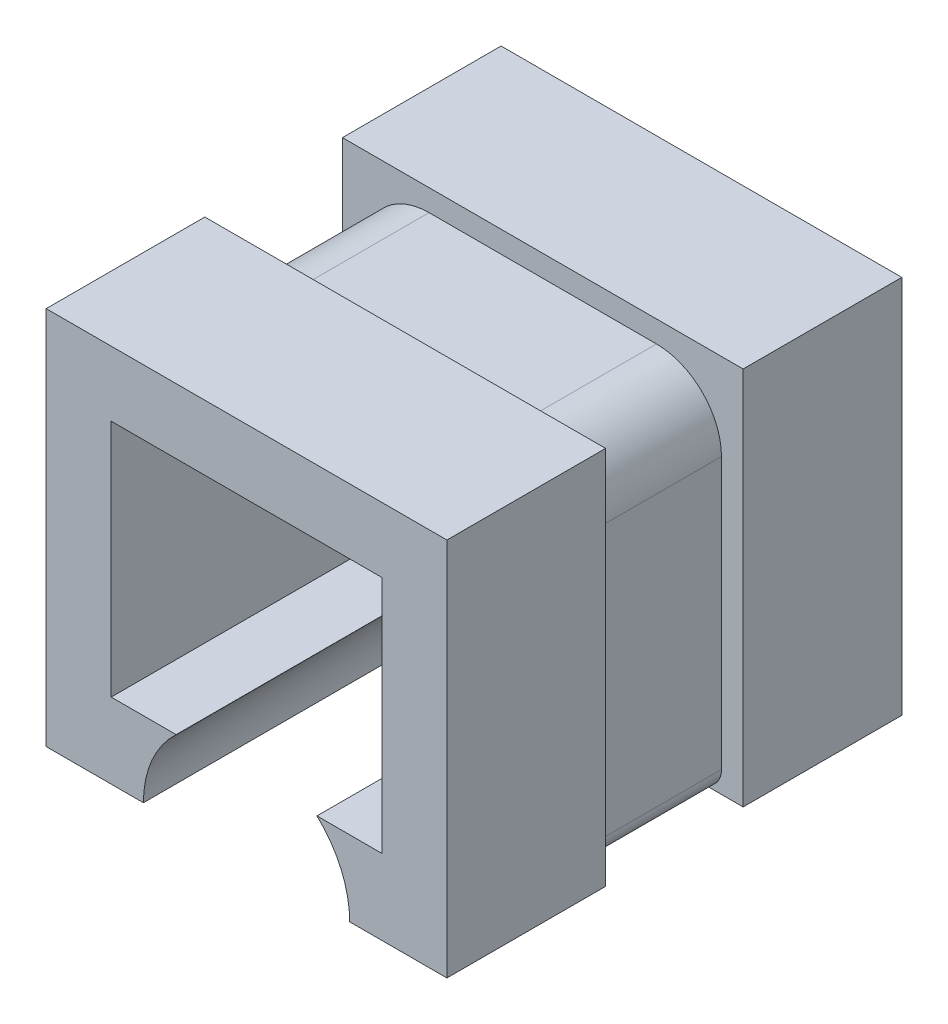
ISO-10303-21;
HEADER;
FILE_DESCRIPTION(('STEP AP214'),'2;1');
FILE_NAME('part.step','',(''),(''),'','','');
FILE_SCHEMA(('AUTOMOTIVE_DESIGN { 1 0 10303 214 1 1 1 1 }'));
ENDSEC;
DATA;
#1=APPLICATION_CONTEXT('core data for automotive mechanical design processes');
#2=APPLICATION_PROTOCOL_DEFINITION('international standard','automotive_design',2000,#1);
#3=PRODUCT_CONTEXT('',#1,'mechanical');
#4=PRODUCT('Part','Part','',(#3));
#5=PRODUCT_RELATED_PRODUCT_CATEGORY('part','',(#4));
#6=PRODUCT_DEFINITION_FORMATION('','',#4);
#7=PRODUCT_DEFINITION_CONTEXT('part definition',#1,'design');
#8=PRODUCT_DEFINITION('design','',#6,#7);
#9=PRODUCT_DEFINITION_SHAPE('','',#8);
#10=(LENGTH_UNIT() NAMED_UNIT(*) SI_UNIT(.MILLI.,.METRE.));
#11=(NAMED_UNIT(*) PLANE_ANGLE_UNIT() SI_UNIT($,.RADIAN.));
#12=(NAMED_UNIT(*) SI_UNIT($,.STERADIAN.) SOLID_ANGLE_UNIT());
#13=UNCERTAINTY_MEASURE_WITH_UNIT(LENGTH_MEASURE(1.E-05),#10,'distance_accuracy_value','');
#14=(GEOMETRIC_REPRESENTATION_CONTEXT(3) GLOBAL_UNCERTAINTY_ASSIGNED_CONTEXT((#13)) GLOBAL_UNIT_ASSIGNED_CONTEXT((#10,
#11,#12)) REPRESENTATION_CONTEXT('',''));
#15=CARTESIAN_POINT('',(0.,0.,0.));
#16=DIRECTION('',(0.,0.,1.));
#17=DIRECTION('',(1.,0.,0.));
#18=AXIS2_PLACEMENT_3D('',#15,#16,#17);
#19=CARTESIAN_POINT('',(-9.25000000000001,17.5125,10.5));
#20=DIRECTION('',(0.,-1.,0.));
#21=DIRECTION('',(1.,0.,0.));
#22=AXIS2_PLACEMENT_3D('',#19,#20,#21);
#23=PLANE('',#22);
#24=DIRECTION('',(-1.,0.,0.));
#25=VECTOR('',#24,1.);
#26=CARTESIAN_POINT('',(0.,17.5125,-3.175));
#27=LINE('',#26,#25);
#28=CARTESIAN_POINT('',(9.25000000000001,17.5125,-3.175));
#29=VERTEX_POINT('',#28);
#30=CARTESIAN_POINT('',(-9.25000000000001,17.5125,-3.175));
#31=VERTEX_POINT('',#30);
#32=EDGE_CURVE('E192',#29,#31,#27,.T.);
#33=ORIENTED_EDGE('',*,*,#32,.F.);
#34=DIRECTION('',(0.,0.,-1.));
#35=VECTOR('',#34,1.);
#36=CARTESIAN_POINT('',(9.24999999999999,17.5125,10.5));
#37=LINE('',#36,#35);
#38=CARTESIAN_POINT('',(9.24999999999999,17.5125,-10.5));
#39=VERTEX_POINT('',#38);
#40=EDGE_CURVE('E196',#29,#39,#37,.T.);
#41=ORIENTED_EDGE('',*,*,#40,.T.);
#42=DIRECTION('',(-1.,0.,0.));
#43=VECTOR('',#42,1.);
#44=CARTESIAN_POINT('',(-9.25000000000001,17.5125,-10.5));
#45=LINE('',#44,#43);
#46=CARTESIAN_POINT('',(-9.25000000000001,17.5125,-10.5));
#47=VERTEX_POINT('',#46);
#48=EDGE_CURVE('E315',#39,#47,#45,.T.);
#49=ORIENTED_EDGE('',*,*,#48,.T.);
#50=DIRECTION('',(0.,0.,-1.));
#51=VECTOR('',#50,1.);
#52=CARTESIAN_POINT('',(-9.25000000000001,17.5125,10.5));
#53=LINE('',#52,#51);
#54=EDGE_CURVE('E198',#31,#47,#53,.T.);
#55=ORIENTED_EDGE('',*,*,#54,.F.);
#56=EDGE_LOOP('',(#33,#41,#49,#55));
#57=FACE_BOUND('',#56,.T.);
#58=ADVANCED_FACE('F33',(#57),#23,.F.);
#59=CARTESIAN_POINT('',(9.25,0.,10.5));
#60=DIRECTION('',(0.,1.,0.));
#61=DIRECTION('',(-1.,0.,0.));
#62=AXIS2_PLACEMENT_3D('',#59,#60,#61);
#63=PLANE('',#62);
#64=DIRECTION('',(0.,0.,1.));
#65=VECTOR('',#64,1.);
#66=CARTESIAN_POINT('',(7.25,0.,3.175));
#67=LINE('',#66,#65);
#68=CARTESIAN_POINT('',(7.25,0.,-3.175));
#69=VERTEX_POINT('',#68);
#70=CARTESIAN_POINT('',(7.25,0.,3.175));
#71=VERTEX_POINT('',#70);
#72=EDGE_CURVE('E271',#69,#71,#67,.T.);
#73=ORIENTED_EDGE('',*,*,#72,.T.);
#74=DIRECTION('',(-1.,0.,0.));
#75=VECTOR('',#74,1.);
#76=CARTESIAN_POINT('',(9.25,0.,3.175));
#77=LINE('',#76,#75);
#78=CARTESIAN_POINT('',(9.25,0.,3.175));
#79=VERTEX_POINT('',#78);
#80=EDGE_CURVE('E211',#79,#71,#77,.T.);
#81=ORIENTED_EDGE('',*,*,#80,.F.);
#82=DIRECTION('',(0.,0.,-1.));
#83=VECTOR('',#82,1.);
#84=CARTESIAN_POINT('',(9.25,0.,10.5));
#85=LINE('',#84,#83);
#86=CARTESIAN_POINT('',(9.25,0.,10.5));
#87=VERTEX_POINT('',#86);
#88=EDGE_CURVE('E226',#87,#79,#85,.T.);
#89=ORIENTED_EDGE('',*,*,#88,.F.);
#90=DIRECTION('',(1.,0.,0.));
#91=VECTOR('',#90,1.);
#92=CARTESIAN_POINT('',(9.25,0.,10.5));
#93=LINE('',#92,#91);
#94=CARTESIAN_POINT('',(4.7625,0.,10.5));
#95=VERTEX_POINT('',#94);
#96=EDGE_CURVE('E342',#95,#87,#93,.T.);
#97=ORIENTED_EDGE('',*,*,#96,.F.);
#98=DIRECTION('',(0.,0.,-1.));
#99=VECTOR('',#98,1.);
#100=CARTESIAN_POINT('',(4.7625,0.,10.5));
#101=LINE('',#100,#99);
#102=CARTESIAN_POINT('',(4.7625,0.,-10.5));
#103=VERTEX_POINT('',#102);
#104=EDGE_CURVE('E229',#95,#103,#101,.T.);
#105=ORIENTED_EDGE('',*,*,#104,.T.);
#106=DIRECTION('',(1.,0.,0.));
#107=VECTOR('',#106,1.);
#108=CARTESIAN_POINT('',(9.25,0.,-10.5));
#109=LINE('',#108,#107);
#110=CARTESIAN_POINT('',(9.25,0.,-10.5));
#111=VERTEX_POINT('',#110);
#112=EDGE_CURVE('E318',#103,#111,#109,.T.);
#113=ORIENTED_EDGE('',*,*,#112,.T.);
#114=CARTESIAN_POINT('',(9.25,0.,-3.175));
#115=VERTEX_POINT('',#114);
#116=EDGE_CURVE('E221',#115,#111,#85,.T.);
#117=ORIENTED_EDGE('',*,*,#116,.F.);
#118=DIRECTION('',(-1.,0.,0.));
#119=VECTOR('',#118,1.);
#120=CARTESIAN_POINT('',(9.25,0.,-3.175));
#121=LINE('',#120,#119);
#122=EDGE_CURVE('E207',#115,#69,#121,.T.);
#123=ORIENTED_EDGE('',*,*,#122,.T.);
#124=EDGE_LOOP('',(#73,#81,#89,#97,#105,#113,#117,#123));
#125=FACE_BOUND('',#124,.T.);
#126=ADVANCED_FACE('F413',(#125),#63,.F.);
#127=CARTESIAN_POINT('',(9.24999999999999,17.5125,10.5));
#128=DIRECTION('',(-1.,0.,0.));
#129=DIRECTION('',(0.,-1.,0.));
#130=AXIS2_PLACEMENT_3D('',#127,#128,#129);
#131=PLANE('',#130);
#132=DIRECTION('',(0.,-1.,0.));
#133=VECTOR('',#132,1.);
#134=CARTESIAN_POINT('',(9.25000000000001,17.5125,-3.175));
#135=LINE('',#134,#133);
#136=EDGE_CURVE('E204',#29,#115,#135,.T.);
#137=ORIENTED_EDGE('',*,*,#136,.T.);
#138=ORIENTED_EDGE('',*,*,#116,.T.);
#139=DIRECTION('',(0.,1.,0.));
#140=VECTOR('',#139,1.);
#141=CARTESIAN_POINT('',(9.24999999999999,17.5125,-10.5));
#142=LINE('',#141,#140);
#143=EDGE_CURVE('E215',#111,#39,#142,.T.);
#144=ORIENTED_EDGE('',*,*,#143,.T.);
#145=ORIENTED_EDGE('',*,*,#40,.F.);
#146=EDGE_LOOP('',(#137,#138,#144,#145));
#147=FACE_BOUND('',#146,.T.);
#148=ADVANCED_FACE('F213',(#147),#131,.F.);
#149=CARTESIAN_POINT('',(9.24999999999999,17.5125,10.5));
#150=VERTEX_POINT('',#149);
#151=CARTESIAN_POINT('',(9.25000000000001,17.5125,3.175));
#152=VERTEX_POINT('',#151);
#153=EDGE_CURVE('E217',#150,#152,#37,.T.);
#154=ORIENTED_EDGE('',*,*,#153,.T.);
#155=DIRECTION('',(-1.,0.,0.));
#156=VECTOR('',#155,1.);
#157=CARTESIAN_POINT('',(0.,17.5125,3.175));
#158=LINE('',#157,#156);
#159=CARTESIAN_POINT('',(-9.25000000000001,17.5125,3.175));
#160=VERTEX_POINT('',#159);
#161=EDGE_CURVE('E358',#152,#160,#158,.T.);
#162=ORIENTED_EDGE('',*,*,#161,.T.);
#163=CARTESIAN_POINT('',(-9.25000000000001,17.5125,10.5));
#164=VERTEX_POINT('',#163);
#165=EDGE_CURVE('E218',#164,#160,#53,.T.);
#166=ORIENTED_EDGE('',*,*,#165,.F.);
#167=DIRECTION('',(-1.,0.,0.));
#168=VECTOR('',#167,1.);
#169=CARTESIAN_POINT('',(-9.25000000000001,17.5125,10.5));
#170=LINE('',#169,#168);
#171=EDGE_CURVE('E338',#150,#164,#170,.T.);
#172=ORIENTED_EDGE('',*,*,#171,.F.);
#173=EDGE_LOOP('',(#154,#162,#166,#172));
#174=FACE_BOUND('',#173,.T.);
#175=ADVANCED_FACE('F415',(#174),#23,.F.);
#176=CARTESIAN_POINT('',(-9.25,0.,10.5));
#177=DIRECTION('',(1.,0.,0.));
#178=DIRECTION('',(0.,1.,0.));
#179=AXIS2_PLACEMENT_3D('',#176,#177,#178);
#180=PLANE('',#179);
#181=DIRECTION('',(0.,-1.,0.));
#182=VECTOR('',#181,1.);
#183=CARTESIAN_POINT('',(-9.25000000000001,17.5125,-3.175));
#184=LINE('',#183,#182);
#185=CARTESIAN_POINT('',(-9.25,0.,-3.175));
#186=VERTEX_POINT('',#185);
#187=EDGE_CURVE('E298',#31,#186,#184,.T.);
#188=ORIENTED_EDGE('',*,*,#187,.F.);
#189=ORIENTED_EDGE('',*,*,#54,.T.);
#190=DIRECTION('',(0.,-1.,0.));
#191=VECTOR('',#190,1.);
#192=CARTESIAN_POINT('',(-9.25,0.,-10.5));
#193=LINE('',#192,#191);
#194=CARTESIAN_POINT('',(-9.25,0.,-10.5));
#195=VERTEX_POINT('',#194);
#196=EDGE_CURVE('E303',#47,#195,#193,.T.);
#197=ORIENTED_EDGE('',*,*,#196,.T.);
#198=DIRECTION('',(0.,0.,-1.));
#199=VECTOR('',#198,1.);
#200=CARTESIAN_POINT('',(-9.25,0.,10.5));
#201=LINE('',#200,#199);
#202=EDGE_CURVE('E295',#186,#195,#201,.T.);
#203=ORIENTED_EDGE('',*,*,#202,.F.);
#204=EDGE_LOOP('',(#188,#189,#197,#203));
#205=FACE_BOUND('',#204,.T.);
#206=ADVANCED_FACE('F301',(#205),#180,.F.);
#207=CARTESIAN_POINT('',(-4.7625,0.,10.5));
#208=DIRECTION('',(0.,1.,0.));
#209=DIRECTION('',(-1.,0.,0.));
#210=AXIS2_PLACEMENT_3D('',#207,#208,#209);
#211=PLANE('',#210);
#212=DIRECTION('',(1.,0.,0.));
#213=VECTOR('',#212,1.);
#214=CARTESIAN_POINT('',(-9.25,0.,3.175));
#215=LINE('',#214,#213);
#216=CARTESIAN_POINT('',(-9.25,0.,3.175));
#217=VERTEX_POINT('',#216);
#218=CARTESIAN_POINT('',(-7.25,0.,3.175));
#219=VERTEX_POINT('',#218);
#220=EDGE_CURVE('E48',#217,#219,#215,.T.);
#221=ORIENTED_EDGE('',*,*,#220,.T.);
#222=DIRECTION('',(0.,0.,1.));
#223=VECTOR('',#222,1.);
#224=CARTESIAN_POINT('',(-7.25,0.,10.5));
#225=LINE('',#224,#223);
#226=CARTESIAN_POINT('',(-7.25,0.,-3.175));
#227=VERTEX_POINT('',#226);
#228=EDGE_CURVE('E279',#219,#227,#225,.F.);
#229=ORIENTED_EDGE('',*,*,#228,.T.);
#230=DIRECTION('',(1.,0.,0.));
#231=VECTOR('',#230,1.);
#232=CARTESIAN_POINT('',(-9.25,0.,-3.175));
#233=LINE('',#232,#231);
#234=EDGE_CURVE('E55',#186,#227,#233,.T.);
#235=ORIENTED_EDGE('',*,*,#234,.F.);
#236=ORIENTED_EDGE('',*,*,#202,.T.);
#237=DIRECTION('',(1.,0.,0.));
#238=VECTOR('',#237,1.);
#239=CARTESIAN_POINT('',(-4.7625,0.,-10.5));
#240=LINE('',#239,#238);
#241=CARTESIAN_POINT('',(-4.7625,0.,-10.5));
#242=VERTEX_POINT('',#241);
#243=EDGE_CURVE('E311',#195,#242,#240,.T.);
#244=ORIENTED_EDGE('',*,*,#243,.T.);
#245=DIRECTION('',(0.,0.,-1.));
#246=VECTOR('',#245,1.);
#247=CARTESIAN_POINT('',(-4.7625,0.,10.5));
#248=LINE('',#247,#246);
#249=CARTESIAN_POINT('',(-4.7625,0.,10.5));
#250=VERTEX_POINT('',#249);
#251=EDGE_CURVE('E306',#250,#242,#248,.T.);
#252=ORIENTED_EDGE('',*,*,#251,.F.);
#253=DIRECTION('',(1.,0.,0.));
#254=VECTOR('',#253,1.);
#255=CARTESIAN_POINT('',(-4.7625,0.,10.5));
#256=LINE('',#255,#254);
#257=CARTESIAN_POINT('',(-9.25,0.,10.5));
#258=VERTEX_POINT('',#257);
#259=EDGE_CURVE('E308',#258,#250,#256,.T.);
#260=ORIENTED_EDGE('',*,*,#259,.F.);
#261=EDGE_CURVE('E305',#258,#217,#201,.T.);
#262=ORIENTED_EDGE('',*,*,#261,.T.);
#263=EDGE_LOOP('',(#221,#229,#235,#236,#244,#252,#260,#262));
#264=FACE_BOUND('',#263,.T.);
#265=ADVANCED_FACE('F293',(#264),#211,.F.);
#266=CARTESIAN_POINT('',(0.,0.,10.5));
#267=DIRECTION('',(0.,0.,-1.));
#268=DIRECTION('',(-1.,0.,0.));
#269=AXIS2_PLACEMENT_3D('',#266,#267,#268);
#270=CYLINDRICAL_SURFACE('',#269,4.7625);
#271=CARTESIAN_POINT('',(0.,0.,-10.5));
#272=DIRECTION('',(0.,0.,-1.));
#273=DIRECTION('',(1.,0.,0.));
#274=AXIS2_PLACEMENT_3D('',#271,#272,#273);
#275=CIRCLE('',#274,4.7625);
#276=CARTESIAN_POINT('',(-3.25,3.48122194782234,-10.5));
#277=VERTEX_POINT('',#276);
#278=EDGE_CURVE('E200',#242,#277,#275,.T.);
#279=ORIENTED_EDGE('',*,*,#278,.T.);
#280=DIRECTION('',(0.,0.,-1.));
#281=VECTOR('',#280,1.);
#282=CARTESIAN_POINT('',(-3.25,3.48122194782234,10.5));
#283=LINE('',#282,#281);
#284=CARTESIAN_POINT('',(-3.25,3.48122194782234,10.5));
#285=VERTEX_POINT('',#284);
#286=EDGE_CURVE('E247',#285,#277,#283,.T.);
#287=ORIENTED_EDGE('',*,*,#286,.F.);
#288=CARTESIAN_POINT('',(0.,0.,10.5));
#289=DIRECTION('',(0.,0.,-1.));
#290=DIRECTION('',(1.,0.,0.));
#291=AXIS2_PLACEMENT_3D('',#288,#289,#290);
#292=CIRCLE('',#291,4.7625);
#293=EDGE_CURVE('E313',#250,#285,#292,.T.);
#294=ORIENTED_EDGE('',*,*,#293,.F.);
#295=ORIENTED_EDGE('',*,*,#251,.T.);
#296=EDGE_LOOP('',(#279,#287,#294,#295));
#297=FACE_BOUND('',#296,.T.);
#298=ADVANCED_FACE('F453',(#297),#270,.F.);
#299=CARTESIAN_POINT('',(-6.25,3.48122194782234,10.5));
#300=DIRECTION('',(0.,-1.,0.));
#301=DIRECTION('',(0.,0.,-1.));
#302=AXIS2_PLACEMENT_3D('',#299,#300,#301);
#303=PLANE('',#302);
#304=DIRECTION('',(-1.,0.,0.));
#305=VECTOR('',#304,1.);
#306=CARTESIAN_POINT('',(-6.25,3.48122194782234,-10.5));
#307=LINE('',#306,#305);
#308=CARTESIAN_POINT('',(-6.25,3.48122194782234,-10.5));
#309=VERTEX_POINT('',#308);
#310=EDGE_CURVE('E331',#277,#309,#307,.T.);
#311=ORIENTED_EDGE('',*,*,#310,.T.);
#312=DIRECTION('',(0.,0.,-1.));
#313=VECTOR('',#312,1.);
#314=CARTESIAN_POINT('',(-6.25,3.48122194782234,10.5));
#315=LINE('',#314,#313);
#316=CARTESIAN_POINT('',(-6.25,3.48122194782234,10.5));
#317=VERTEX_POINT('',#316);
#318=EDGE_CURVE('E244',#317,#309,#315,.T.);
#319=ORIENTED_EDGE('',*,*,#318,.F.);
#320=DIRECTION('',(-1.,0.,0.));
#321=VECTOR('',#320,1.);
#322=CARTESIAN_POINT('',(-6.25,3.48122194782234,10.5));
#323=LINE('',#322,#321);
#324=EDGE_CURVE('E354',#285,#317,#323,.T.);
#325=ORIENTED_EDGE('',*,*,#324,.F.);
#326=ORIENTED_EDGE('',*,*,#286,.T.);
#327=EDGE_LOOP('',(#311,#319,#325,#326));
#328=FACE_BOUND('',#327,.T.);
#329=ADVANCED_FACE('F456',(#328),#303,.F.);
#330=CARTESIAN_POINT('',(-6.25,14.5125,10.5));
#331=DIRECTION('',(-1.,0.,0.));
#332=DIRECTION('',(0.,-1.,0.));
#333=AXIS2_PLACEMENT_3D('',#330,#331,#332);
#334=PLANE('',#333);
#335=DIRECTION('',(0.,1.,0.));
#336=VECTOR('',#335,1.);
#337=CARTESIAN_POINT('',(-6.25,14.5125,-10.5));
#338=LINE('',#337,#336);
#339=CARTESIAN_POINT('',(-6.25,14.5125,-10.5));
#340=VERTEX_POINT('',#339);
#341=EDGE_CURVE('E329',#309,#340,#338,.T.);
#342=ORIENTED_EDGE('',*,*,#341,.T.);
#343=DIRECTION('',(0.,0.,-1.));
#344=VECTOR('',#343,1.);
#345=CARTESIAN_POINT('',(-6.25,14.5125,10.5));
#346=LINE('',#345,#344);
#347=CARTESIAN_POINT('',(-6.25,14.5125,10.5));
#348=VERTEX_POINT('',#347);
#349=EDGE_CURVE('E241',#348,#340,#346,.T.);
#350=ORIENTED_EDGE('',*,*,#349,.F.);
#351=DIRECTION('',(0.,1.,0.));
#352=VECTOR('',#351,1.);
#353=CARTESIAN_POINT('',(-6.25,14.5125,10.5));
#354=LINE('',#353,#352);
#355=EDGE_CURVE('E352',#317,#348,#354,.T.);
#356=ORIENTED_EDGE('',*,*,#355,.F.);
#357=ORIENTED_EDGE('',*,*,#318,.T.);
#358=EDGE_LOOP('',(#342,#350,#356,#357));
#359=FACE_BOUND('',#358,.T.);
#360=ADVANCED_FACE('F460',(#359),#334,.F.);
#361=CARTESIAN_POINT('',(6.25,14.5125,10.5));
#362=DIRECTION('',(0.,1.,0.));
#363=DIRECTION('',(0.,0.,1.));
#364=AXIS2_PLACEMENT_3D('',#361,#362,#363);
#365=PLANE('',#364);
#366=DIRECTION('',(1.,0.,0.));
#367=VECTOR('',#366,1.);
#368=CARTESIAN_POINT('',(6.25,14.5125,-10.5));
#369=LINE('',#368,#367);
#370=CARTESIAN_POINT('',(6.25,14.5125,-10.5));
#371=VERTEX_POINT('',#370);
#372=EDGE_CURVE('E327',#340,#371,#369,.T.);
#373=ORIENTED_EDGE('',*,*,#372,.T.);
#374=DIRECTION('',(0.,0.,-1.));
#375=VECTOR('',#374,1.);
#376=CARTESIAN_POINT('',(6.25,14.5125,10.5));
#377=LINE('',#376,#375);
#378=CARTESIAN_POINT('',(6.25,14.5125,10.5));
#379=VERTEX_POINT('',#378);
#380=EDGE_CURVE('E238',#379,#371,#377,.T.);
#381=ORIENTED_EDGE('',*,*,#380,.F.);
#382=DIRECTION('',(1.,0.,0.));
#383=VECTOR('',#382,1.);
#384=CARTESIAN_POINT('',(6.25,14.5125,10.5));
#385=LINE('',#384,#383);
#386=EDGE_CURVE('E350',#348,#379,#385,.T.);
#387=ORIENTED_EDGE('',*,*,#386,.F.);
#388=ORIENTED_EDGE('',*,*,#349,.T.);
#389=EDGE_LOOP('',(#373,#381,#387,#388));
#390=FACE_BOUND('',#389,.T.);
#391=ADVANCED_FACE('F464',(#390),#365,.F.);
#392=CARTESIAN_POINT('',(6.25,3.48122194782234,10.5));
#393=DIRECTION('',(1.,0.,0.));
#394=DIRECTION('',(0.,1.,0.));
#395=AXIS2_PLACEMENT_3D('',#392,#393,#394);
#396=PLANE('',#395);
#397=DIRECTION('',(0.,-1.,0.));
#398=VECTOR('',#397,1.);
#399=CARTESIAN_POINT('',(6.25,3.48122194782234,-10.5));
#400=LINE('',#399,#398);
#401=CARTESIAN_POINT('',(6.25,3.48122194782234,-10.5));
#402=VERTEX_POINT('',#401);
#403=EDGE_CURVE('E325',#371,#402,#400,.T.);
#404=ORIENTED_EDGE('',*,*,#403,.T.);
#405=DIRECTION('',(0.,0.,-1.));
#406=VECTOR('',#405,1.);
#407=CARTESIAN_POINT('',(6.25,3.48122194782234,10.5));
#408=LINE('',#407,#406);
#409=CARTESIAN_POINT('',(6.25,3.48122194782234,10.5));
#410=VERTEX_POINT('',#409);
#411=EDGE_CURVE('E235',#410,#402,#408,.T.);
#412=ORIENTED_EDGE('',*,*,#411,.F.);
#413=DIRECTION('',(0.,-1.,0.));
#414=VECTOR('',#413,1.);
#415=CARTESIAN_POINT('',(6.25,3.48122194782234,10.5));
#416=LINE('',#415,#414);
#417=EDGE_CURVE('E348',#379,#410,#416,.T.);
#418=ORIENTED_EDGE('',*,*,#417,.F.);
#419=ORIENTED_EDGE('',*,*,#380,.T.);
#420=EDGE_LOOP('',(#404,#412,#418,#419));
#421=FACE_BOUND('',#420,.T.);
#422=ADVANCED_FACE('F468',(#421),#396,.F.);
#423=CARTESIAN_POINT('',(6.25,3.48122194782234,10.5));
#424=DIRECTION('',(0.,-1.,0.));
#425=DIRECTION('',(0.,0.,-1.));
#426=AXIS2_PLACEMENT_3D('',#423,#424,#425);
#427=PLANE('',#426);
#428=DIRECTION('',(-1.,0.,0.));
#429=VECTOR('',#428,1.);
#430=CARTESIAN_POINT('',(6.25,3.48122194782234,-10.5));
#431=LINE('',#430,#429);
#432=CARTESIAN_POINT('',(3.25,3.48122194782234,-10.5));
#433=VERTEX_POINT('',#432);
#434=EDGE_CURVE('E323',#402,#433,#431,.T.);
#435=ORIENTED_EDGE('',*,*,#434,.T.);
#436=DIRECTION('',(0.,0.,-1.));
#437=VECTOR('',#436,1.);
#438=CARTESIAN_POINT('',(3.25,3.48122194782234,10.5));
#439=LINE('',#438,#437);
#440=CARTESIAN_POINT('',(3.25,3.48122194782234,10.5));
#441=VERTEX_POINT('',#440);
#442=EDGE_CURVE('E232',#441,#433,#439,.T.);
#443=ORIENTED_EDGE('',*,*,#442,.F.);
#444=DIRECTION('',(-1.,0.,0.));
#445=VECTOR('',#444,1.);
#446=CARTESIAN_POINT('',(6.25,3.48122194782234,10.5));
#447=LINE('',#446,#445);
#448=EDGE_CURVE('E346',#410,#441,#447,.T.);
#449=ORIENTED_EDGE('',*,*,#448,.F.);
#450=ORIENTED_EDGE('',*,*,#411,.T.);
#451=EDGE_LOOP('',(#435,#443,#449,#450));
#452=FACE_BOUND('',#451,.T.);
#453=ADVANCED_FACE('F472',(#452),#427,.F.);
#454=CARTESIAN_POINT('',(0.,0.,10.5));
#455=DIRECTION('',(0.,0.,-1.));
#456=DIRECTION('',(-1.,0.,0.));
#457=AXIS2_PLACEMENT_3D('',#454,#455,#456);
#458=CYLINDRICAL_SURFACE('',#457,4.7625);
#459=CARTESIAN_POINT('',(0.,0.,-10.5));
#460=DIRECTION('',(0.,0.,-1.));
#461=DIRECTION('',(1.,0.,0.));
#462=AXIS2_PLACEMENT_3D('',#459,#460,#461);
#463=CIRCLE('',#462,4.7625);
#464=EDGE_CURVE('E321',#433,#103,#463,.T.);
#465=ORIENTED_EDGE('',*,*,#464,.T.);
#466=ORIENTED_EDGE('',*,*,#104,.F.);
#467=CARTESIAN_POINT('',(0.,0.,10.5));
#468=DIRECTION('',(0.,0.,-1.));
#469=DIRECTION('',(1.,0.,0.));
#470=AXIS2_PLACEMENT_3D('',#467,#468,#469);
#471=CIRCLE('',#470,4.7625);
#472=EDGE_CURVE('E344',#441,#95,#471,.T.);
#473=ORIENTED_EDGE('',*,*,#472,.F.);
#474=ORIENTED_EDGE('',*,*,#442,.T.);
#475=EDGE_LOOP('',(#465,#466,#473,#474));
#476=FACE_BOUND('',#475,.T.);
#477=ADVANCED_FACE('F476',(#476),#458,.F.);
#478=ORIENTED_EDGE('',*,*,#88,.T.);
#479=DIRECTION('',(0.,-1.,0.));
#480=VECTOR('',#479,1.);
#481=CARTESIAN_POINT('',(9.25000000000001,17.5125,3.175));
#482=LINE('',#481,#480);
#483=EDGE_CURVE('E375',#152,#79,#482,.T.);
#484=ORIENTED_EDGE('',*,*,#483,.F.);
#485=ORIENTED_EDGE('',*,*,#153,.F.);
#486=DIRECTION('',(0.,1.,0.));
#487=VECTOR('',#486,1.);
#488=CARTESIAN_POINT('',(9.24999999999999,17.5125,10.5));
#489=LINE('',#488,#487);
#490=EDGE_CURVE('E340',#87,#150,#489,.T.);
#491=ORIENTED_EDGE('',*,*,#490,.F.);
#492=EDGE_LOOP('',(#478,#484,#485,#491));
#493=FACE_BOUND('',#492,.T.);
#494=ADVANCED_FACE('F430',(#493),#131,.F.);
#495=ORIENTED_EDGE('',*,*,#165,.T.);
#496=DIRECTION('',(0.,-1.,0.));
#497=VECTOR('',#496,1.);
#498=CARTESIAN_POINT('',(-9.25000000000001,17.5125,3.175));
#499=LINE('',#498,#497);
#500=EDGE_CURVE('E366',#160,#217,#499,.T.);
#501=ORIENTED_EDGE('',*,*,#500,.T.);
#502=ORIENTED_EDGE('',*,*,#261,.F.);
#503=DIRECTION('',(0.,-1.,0.));
#504=VECTOR('',#503,1.);
#505=CARTESIAN_POINT('',(-9.25,0.,10.5));
#506=LINE('',#505,#504);
#507=EDGE_CURVE('E336',#164,#258,#506,.T.);
#508=ORIENTED_EDGE('',*,*,#507,.F.);
#509=EDGE_LOOP('',(#495,#501,#502,#508));
#510=FACE_BOUND('',#509,.T.);
#511=ADVANCED_FACE('F429',(#510),#180,.F.);
#512=CARTESIAN_POINT('',(0.,0.,10.5));
#513=DIRECTION('',(0.,0.,1.));
#514=DIRECTION('',(1.,0.,0.));
#515=AXIS2_PLACEMENT_3D('',#512,#513,#514);
#516=PLANE('',#515);
#517=ORIENTED_EDGE('',*,*,#293,.T.);
#518=ORIENTED_EDGE('',*,*,#324,.T.);
#519=ORIENTED_EDGE('',*,*,#355,.T.);
#520=ORIENTED_EDGE('',*,*,#386,.T.);
#521=ORIENTED_EDGE('',*,*,#417,.T.);
#522=ORIENTED_EDGE('',*,*,#448,.T.);
#523=ORIENTED_EDGE('',*,*,#472,.T.);
#524=ORIENTED_EDGE('',*,*,#96,.T.);
#525=ORIENTED_EDGE('',*,*,#490,.T.);
#526=ORIENTED_EDGE('',*,*,#171,.T.);
#527=ORIENTED_EDGE('',*,*,#507,.T.);
#528=ORIENTED_EDGE('',*,*,#259,.T.);
#529=EDGE_LOOP('',(#517,#518,#519,#520,#521,#522,#523,#524,#525,#526,#527,#528));
#530=FACE_BOUND('',#529,.T.);
#531=ADVANCED_FACE('F484',(#530),#516,.T.);
#532=CARTESIAN_POINT('',(0.,0.,-10.5));
#533=DIRECTION('',(0.,0.,1.));
#534=DIRECTION('',(1.,0.,0.));
#535=AXIS2_PLACEMENT_3D('',#532,#533,#534);
#536=PLANE('',#535);
#537=ORIENTED_EDGE('',*,*,#278,.F.);
#538=ORIENTED_EDGE('',*,*,#243,.F.);
#539=ORIENTED_EDGE('',*,*,#196,.F.);
#540=ORIENTED_EDGE('',*,*,#48,.F.);
#541=ORIENTED_EDGE('',*,*,#143,.F.);
#542=ORIENTED_EDGE('',*,*,#112,.F.);
#543=ORIENTED_EDGE('',*,*,#464,.F.);
#544=ORIENTED_EDGE('',*,*,#434,.F.);
#545=ORIENTED_EDGE('',*,*,#403,.F.);
#546=ORIENTED_EDGE('',*,*,#372,.F.);
#547=ORIENTED_EDGE('',*,*,#341,.F.);
#548=ORIENTED_EDGE('',*,*,#310,.F.);
#549=EDGE_LOOP('',(#537,#538,#539,#540,#541,#542,#543,#544,#545,#546,#547,#548));
#550=FACE_BOUND('',#549,.T.);
#551=ADVANCED_FACE('F409',(#550),#536,.F.);
#552=CARTESIAN_POINT('',(-8.25,16.5125,-3.175));
#553=DIRECTION('',(0.,-1.,0.));
#554=DIRECTION('',(0.,0.,-1.));
#555=AXIS2_PLACEMENT_3D('',#552,#553,#554);
#556=PLANE('',#555);
#557=DIRECTION('',(1.,0.,0.));
#558=VECTOR('',#557,1.);
#559=CARTESIAN_POINT('',(-8.25,16.5125,3.175));
#560=LINE('',#559,#558);
#561=CARTESIAN_POINT('',(-5.25,16.5125,3.175));
#562=VERTEX_POINT('',#561);
#563=CARTESIAN_POINT('',(5.25,16.5125,3.175));
#564=VERTEX_POINT('',#563);
#565=EDGE_CURVE('E361',#562,#564,#560,.T.);
#566=ORIENTED_EDGE('',*,*,#565,.T.);
#567=DIRECTION('',(0.,0.,1.));
#568=VECTOR('',#567,1.);
#569=CARTESIAN_POINT('',(5.25,16.5125,-3.175));
#570=LINE('',#569,#568);
#571=CARTESIAN_POINT('',(5.25,16.5125,-3.175));
#572=VERTEX_POINT('',#571);
#573=EDGE_CURVE('E256',#564,#572,#570,.F.);
#574=ORIENTED_EDGE('',*,*,#573,.T.);
#575=DIRECTION('',(1.,0.,0.));
#576=VECTOR('',#575,1.);
#577=CARTESIAN_POINT('',(-8.25,16.5125,-3.175));
#578=LINE('',#577,#576);
#579=CARTESIAN_POINT('',(-5.25,16.5125,-3.175));
#580=VERTEX_POINT('',#579);
#581=EDGE_CURVE('E201',#580,#572,#578,.T.);
#582=ORIENTED_EDGE('',*,*,#581,.F.);
#583=DIRECTION('',(0.,0.,1.));
#584=VECTOR('',#583,1.);
#585=CARTESIAN_POINT('',(-5.25,16.5125,-3.175));
#586=LINE('',#585,#584);
#587=EDGE_CURVE('E253',#580,#562,#586,.T.);
#588=ORIENTED_EDGE('',*,*,#587,.T.);
#589=EDGE_LOOP('',(#566,#574,#582,#588));
#590=FACE_BOUND('',#589,.T.);
#591=ADVANCED_FACE('F393',(#590),#556,.F.);
#592=CARTESIAN_POINT('',(-8.25,0.,-3.175));
#593=DIRECTION('',(1.,0.,0.));
#594=DIRECTION('',(0.,0.,-1.));
#595=AXIS2_PLACEMENT_3D('',#592,#593,#594);
#596=PLANE('',#595);
#597=DIRECTION('',(0.,1.,0.));
#598=VECTOR('',#597,1.);
#599=CARTESIAN_POINT('',(-8.25,0.,-3.175));
#600=LINE('',#599,#598);
#601=CARTESIAN_POINT('',(-8.25,0.999999999999998,-3.175));
#602=VERTEX_POINT('',#601);
#603=CARTESIAN_POINT('',(-8.25,13.5125,-3.175));
#604=VERTEX_POINT('',#603);
#605=EDGE_CURVE('E297',#602,#604,#600,.T.);
#606=ORIENTED_EDGE('',*,*,#605,.F.);
#607=DIRECTION('',(0.,0.,1.));
#608=VECTOR('',#607,1.);
#609=CARTESIAN_POINT('',(-8.25,0.999999999999998,-3.175));
#610=LINE('',#609,#608);
#611=CARTESIAN_POINT('',(-8.25,0.999999999999998,3.175));
#612=VERTEX_POINT('',#611);
#613=EDGE_CURVE('E276',#602,#612,#610,.T.);
#614=ORIENTED_EDGE('',*,*,#613,.T.);
#615=DIRECTION('',(0.,1.,0.));
#616=VECTOR('',#615,1.);
#617=CARTESIAN_POINT('',(-8.25,0.,3.175));
#618=LINE('',#617,#616);
#619=CARTESIAN_POINT('',(-8.25,13.5125,3.175));
#620=VERTEX_POINT('',#619);
#621=EDGE_CURVE('E289',#612,#620,#618,.T.);
#622=ORIENTED_EDGE('',*,*,#621,.T.);
#623=DIRECTION('',(0.,0.,1.));
#624=VECTOR('',#623,1.);
#625=CARTESIAN_POINT('',(-8.25,13.5125,-3.175));
#626=LINE('',#625,#624);
#627=EDGE_CURVE('E258',#620,#604,#626,.F.);
#628=ORIENTED_EDGE('',*,*,#627,.T.);
#629=EDGE_LOOP('',(#606,#614,#622,#628));
#630=FACE_BOUND('',#629,.T.);
#631=ADVANCED_FACE('F401',(#630),#596,.F.);
#632=CARTESIAN_POINT('',(0.,0.,-3.175));
#633=DIRECTION('',(0.,0.,1.));
#634=DIRECTION('',(1.,0.,0.));
#635=AXIS2_PLACEMENT_3D('',#632,#633,#634);
#636=PLANE('',#635);
#637=ORIENTED_EDGE('',*,*,#187,.T.);
#638=ORIENTED_EDGE('',*,*,#234,.T.);
#639=CARTESIAN_POINT('',(-7.25,0.999999999999998,-3.175));
#640=DIRECTION('',(0.,0.,1.));
#641=DIRECTION('',(1.,0.,0.));
#642=AXIS2_PLACEMENT_3D('',#639,#640,#641);
#643=CIRCLE('',#642,1.);
#644=EDGE_CURVE('E11',#227,#602,#643,.F.);
#645=ORIENTED_EDGE('',*,*,#644,.T.);
#646=ORIENTED_EDGE('',*,*,#605,.T.);
#647=CARTESIAN_POINT('',(-5.25,13.5125,-3.175));
#648=DIRECTION('',(0.,0.,1.));
#649=DIRECTION('',(1.,0.,0.));
#650=AXIS2_PLACEMENT_3D('',#647,#648,#649);
#651=CIRCLE('',#650,3.);
#652=EDGE_CURVE('E269',#604,#580,#651,.F.);
#653=ORIENTED_EDGE('',*,*,#652,.T.);
#654=ORIENTED_EDGE('',*,*,#581,.T.);
#655=CARTESIAN_POINT('',(5.25,13.5125,-3.175));
#656=DIRECTION('',(0.,0.,1.));
#657=DIRECTION('',(1.,0.,0.));
#658=AXIS2_PLACEMENT_3D('',#655,#656,#657);
#659=CIRCLE('',#658,3.);
#660=CARTESIAN_POINT('',(8.25,13.5125,-3.175));
#661=VERTEX_POINT('',#660);
#662=EDGE_CURVE('E263',#572,#661,#659,.F.);
#663=ORIENTED_EDGE('',*,*,#662,.T.);
#664=DIRECTION('',(0.,1.,0.));
#665=VECTOR('',#664,1.);
#666=CARTESIAN_POINT('',(8.25,0.,-3.175));
#667=LINE('',#666,#665);
#668=CARTESIAN_POINT('',(8.25,0.999999999999998,-3.175));
#669=VERTEX_POINT('',#668);
#670=EDGE_CURVE('E210',#669,#661,#667,.T.);
#671=ORIENTED_EDGE('',*,*,#670,.F.);
#672=CARTESIAN_POINT('',(7.25,0.999999999999998,-3.175));
#673=DIRECTION('',(0.,0.,1.));
#674=DIRECTION('',(1.,0.,0.));
#675=AXIS2_PLACEMENT_3D('',#672,#673,#674);
#676=CIRCLE('',#675,1.);
#677=EDGE_CURVE('E283',#669,#69,#676,.F.);
#678=ORIENTED_EDGE('',*,*,#677,.T.);
#679=ORIENTED_EDGE('',*,*,#122,.F.);
#680=ORIENTED_EDGE('',*,*,#136,.F.);
#681=ORIENTED_EDGE('',*,*,#32,.T.);
#682=EDGE_LOOP('',(#637,#638,#645,#646,#653,#654,#663,#671,#678,#679,#680,#681));
#683=FACE_BOUND('',#682,.T.);
#684=ADVANCED_FACE('F205',(#683),#636,.T.);
#685=CARTESIAN_POINT('',(0.,0.,3.175));
#686=DIRECTION('',(0.,0.,1.));
#687=DIRECTION('',(1.,0.,0.));
#688=AXIS2_PLACEMENT_3D('',#685,#686,#687);
#689=PLANE('',#688);
#690=ORIENTED_EDGE('',*,*,#500,.F.);
#691=ORIENTED_EDGE('',*,*,#161,.F.);
#692=ORIENTED_EDGE('',*,*,#483,.T.);
#693=ORIENTED_EDGE('',*,*,#80,.T.);
#694=CARTESIAN_POINT('',(7.25,0.999999999999998,3.175));
#695=DIRECTION('',(0.,0.,1.));
#696=DIRECTION('',(1.,0.,0.));
#697=AXIS2_PLACEMENT_3D('',#694,#695,#696);
#698=CIRCLE('',#697,1.);
#699=CARTESIAN_POINT('',(8.25,0.999999999999998,3.175));
#700=VERTEX_POINT('',#699);
#701=EDGE_CURVE('E281',#71,#700,#698,.T.);
#702=ORIENTED_EDGE('',*,*,#701,.T.);
#703=DIRECTION('',(0.,1.,0.));
#704=VECTOR('',#703,1.);
#705=CARTESIAN_POINT('',(8.25,0.,3.175));
#706=LINE('',#705,#704);
#707=CARTESIAN_POINT('',(8.25,13.5125,3.175));
#708=VERTEX_POINT('',#707);
#709=EDGE_CURVE('E373',#700,#708,#706,.T.);
#710=ORIENTED_EDGE('',*,*,#709,.T.);
#711=CARTESIAN_POINT('',(5.25,13.5125,3.175));
#712=DIRECTION('',(0.,0.,1.));
#713=DIRECTION('',(1.,0.,0.));
#714=AXIS2_PLACEMENT_3D('',#711,#712,#713);
#715=CIRCLE('',#714,3.);
#716=EDGE_CURVE('E261',#708,#564,#715,.T.);
#717=ORIENTED_EDGE('',*,*,#716,.T.);
#718=ORIENTED_EDGE('',*,*,#565,.F.);
#719=CARTESIAN_POINT('',(-5.25,13.5125,3.175));
#720=DIRECTION('',(0.,0.,1.));
#721=DIRECTION('',(1.,0.,0.));
#722=AXIS2_PLACEMENT_3D('',#719,#720,#721);
#723=CIRCLE('',#722,3.);
#724=EDGE_CURVE('E266',#562,#620,#723,.T.);
#725=ORIENTED_EDGE('',*,*,#724,.T.);
#726=ORIENTED_EDGE('',*,*,#621,.F.);
#727=CARTESIAN_POINT('',(-7.25,0.999999999999998,3.175));
#728=DIRECTION('',(0.,0.,1.));
#729=DIRECTION('',(1.,0.,0.));
#730=AXIS2_PLACEMENT_3D('',#727,#728,#729);
#731=CIRCLE('',#730,1.);
#732=EDGE_CURVE('E41',#612,#219,#731,.T.);
#733=ORIENTED_EDGE('',*,*,#732,.T.);
#734=ORIENTED_EDGE('',*,*,#220,.F.);
#735=EDGE_LOOP('',(#690,#691,#692,#693,#702,#710,#717,#718,#725,#726,#733,#734));
#736=FACE_BOUND('',#735,.T.);
#737=ADVANCED_FACE('F287',(#736),#689,.F.);
#738=CARTESIAN_POINT('',(8.25,0.,-3.175));
#739=DIRECTION('',(1.,0.,0.));
#740=DIRECTION('',(0.,0.,-1.));
#741=AXIS2_PLACEMENT_3D('',#738,#739,#740);
#742=PLANE('',#741);
#743=ORIENTED_EDGE('',*,*,#709,.F.);
#744=DIRECTION('',(0.,0.,1.));
#745=VECTOR('',#744,1.);
#746=CARTESIAN_POINT('',(8.25,0.999999999999998,-3.175));
#747=LINE('',#746,#745);
#748=EDGE_CURVE('E274',#700,#669,#747,.F.);
#749=ORIENTED_EDGE('',*,*,#748,.T.);
#750=ORIENTED_EDGE('',*,*,#670,.T.);
#751=DIRECTION('',(0.,0.,1.));
#752=VECTOR('',#751,1.);
#753=CARTESIAN_POINT('',(8.25,13.5125,3.175));
#754=LINE('',#753,#752);
#755=EDGE_CURVE('E250',#661,#708,#754,.T.);
#756=ORIENTED_EDGE('',*,*,#755,.T.);
#757=EDGE_LOOP('',(#743,#749,#750,#756));
#758=FACE_BOUND('',#757,.T.);
#759=ADVANCED_FACE('F381',(#758),#742,.T.);
#760=CARTESIAN_POINT('',(5.25,13.5125,-3.175));
#761=DIRECTION('',(0.,0.,-1.));
#762=DIRECTION('',(-1.,0.,0.));
#763=AXIS2_PLACEMENT_3D('',#760,#761,#762);
#764=CYLINDRICAL_SURFACE('',#763,3.);
#765=ORIENTED_EDGE('',*,*,#662,.F.);
#766=ORIENTED_EDGE('',*,*,#573,.F.);
#767=ORIENTED_EDGE('',*,*,#716,.F.);
#768=ORIENTED_EDGE('',*,*,#755,.F.);
#769=EDGE_LOOP('',(#765,#766,#767,#768));
#770=FACE_BOUND('',#769,.T.);
#771=ADVANCED_FACE('F390',(#770),#764,.T.);
#772=CARTESIAN_POINT('',(-5.25,13.5125,-3.175));
#773=DIRECTION('',(0.,0.,1.));
#774=DIRECTION('',(1.,0.,0.));
#775=AXIS2_PLACEMENT_3D('',#772,#773,#774);
#776=CYLINDRICAL_SURFACE('',#775,3.);
#777=ORIENTED_EDGE('',*,*,#652,.F.);
#778=ORIENTED_EDGE('',*,*,#627,.F.);
#779=ORIENTED_EDGE('',*,*,#724,.F.);
#780=ORIENTED_EDGE('',*,*,#587,.F.);
#781=EDGE_LOOP('',(#777,#778,#779,#780));
#782=FACE_BOUND('',#781,.T.);
#783=ADVANCED_FACE('F397',(#782),#776,.T.);
#784=CARTESIAN_POINT('',(7.25,0.999999999999998,10.5));
#785=DIRECTION('',(0.,0.,-1.));
#786=DIRECTION('',(-1.,0.,0.));
#787=AXIS2_PLACEMENT_3D('',#784,#785,#786);
#788=CYLINDRICAL_SURFACE('',#787,1.);
#789=ORIENTED_EDGE('',*,*,#677,.F.);
#790=ORIENTED_EDGE('',*,*,#748,.F.);
#791=ORIENTED_EDGE('',*,*,#701,.F.);
#792=ORIENTED_EDGE('',*,*,#72,.F.);
#793=EDGE_LOOP('',(#789,#790,#791,#792));
#794=FACE_BOUND('',#793,.T.);
#795=ADVANCED_FACE('F443',(#794),#788,.T.);
#796=CARTESIAN_POINT('',(-7.25,0.999999999999998,-3.175));
#797=DIRECTION('',(0.,0.,1.));
#798=DIRECTION('',(1.,0.,0.));
#799=AXIS2_PLACEMENT_3D('',#796,#797,#798);
#800=CYLINDRICAL_SURFACE('',#799,1.);
#801=ORIENTED_EDGE('',*,*,#644,.F.);
#802=ORIENTED_EDGE('',*,*,#228,.F.);
#803=ORIENTED_EDGE('',*,*,#732,.F.);
#804=ORIENTED_EDGE('',*,*,#613,.F.);
#805=EDGE_LOOP('',(#801,#802,#803,#804));
#806=FACE_BOUND('',#805,.T.);
#807=ADVANCED_FACE('F35',(#806),#800,.T.);
#808=CLOSED_SHELL('',(#58,#126,#148,#175,#206,#265,#298,#329,#360,#391,#422,#453,#477,#494,#511,
#531,#551,#591,#631,#684,#737,#759,#771,#783,#795,#807));
#809=MANIFOLD_SOLID_BREP('B2',#808);
#810=ADVANCED_BREP_SHAPE_REPRESENTATION('',(#18,#809),#14);
#811=SHAPE_DEFINITION_REPRESENTATION(#9,#810);
ENDSEC;
END-ISO-10303-21;
